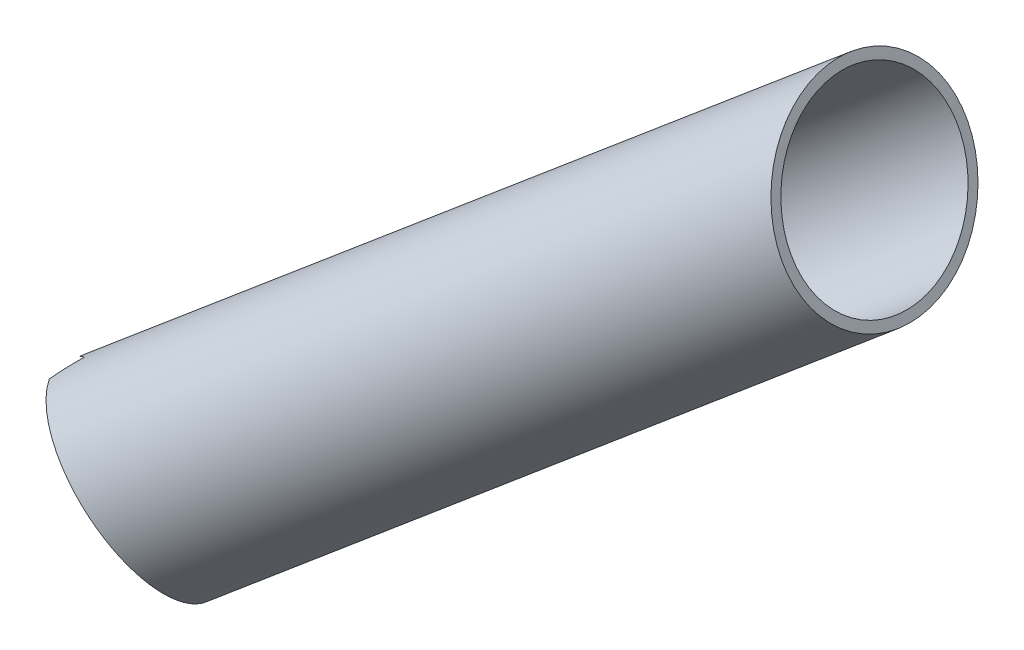
ISO-10303-21;
HEADER;
FILE_DESCRIPTION(('STEP AP214'),'2;1');
FILE_NAME('part.step','',(''),(''),'','','');
FILE_SCHEMA(('AUTOMOTIVE_DESIGN { 1 0 10303 214 1 1 1 1 }'));
ENDSEC;
DATA;
#1=APPLICATION_CONTEXT('core data for automotive mechanical design processes');
#2=APPLICATION_PROTOCOL_DEFINITION('international standard','automotive_design',2000,#1);
#3=PRODUCT_CONTEXT('',#1,'mechanical');
#4=PRODUCT('Part','Part','',(#3));
#5=PRODUCT_RELATED_PRODUCT_CATEGORY('part','',(#4));
#6=PRODUCT_DEFINITION_FORMATION('','',#4);
#7=PRODUCT_DEFINITION_CONTEXT('part definition',#1,'design');
#8=PRODUCT_DEFINITION('design','',#6,#7);
#9=PRODUCT_DEFINITION_SHAPE('','',#8);
#10=(LENGTH_UNIT() NAMED_UNIT(*) SI_UNIT(.MILLI.,.METRE.));
#11=(NAMED_UNIT(*) PLANE_ANGLE_UNIT() SI_UNIT($,.RADIAN.));
#12=(NAMED_UNIT(*) SI_UNIT($,.STERADIAN.) SOLID_ANGLE_UNIT());
#13=UNCERTAINTY_MEASURE_WITH_UNIT(LENGTH_MEASURE(1.E-05),#10,'distance_accuracy_value','');
#14=(GEOMETRIC_REPRESENTATION_CONTEXT(3) GLOBAL_UNCERTAINTY_ASSIGNED_CONTEXT((#13)) GLOBAL_UNIT_ASSIGNED_CONTEXT((#10,
#11,#12)) REPRESENTATION_CONTEXT('',''));
#15=CARTESIAN_POINT('',(0.,0.,0.));
#16=DIRECTION('',(0.,0.,1.));
#17=DIRECTION('',(1.,0.,0.));
#18=AXIS2_PLACEMENT_3D('',#15,#16,#17);
#19=CARTESIAN_POINT('',(-160.,500.,-1140.));
#20=DIRECTION('',(0.764911198117051,0.64413574578278,0.));
#21=DIRECTION('',(-0.64413574578278,0.764911198117051,0.));
#22=AXIS2_PLACEMENT_3D('',#19,#20,#21);
#23=CYLINDRICAL_SURFACE('',#22,11.3);
#24=CARTESIAN_POINT('',(-64.9999999999999,580.,-1140.));
#25=DIRECTION('',(0.939391078868926,0.342847489332319,0.));
#26=DIRECTION('',(-0.342847489332319,0.939391078868926,0.));
#27=AXIS2_PLACEMENT_3D('',#24,#25,#26);
#28=ELLIPSE('',#27,12.0290688874816,11.3);
#29=CARTESIAN_POINT('',(-69.1241360670785,591.3,-1140.));
#30=VERTEX_POINT('',#29);
#31=EDGE_CURVE('E91',#30,#30,#28,.T.);
#32=ORIENTED_EDGE('',*,*,#31,.T.);
#33=EDGE_LOOP('',(#32));
#34=FACE_BOUND('',#33,.T.);
#35=CARTESIAN_POINT('',(-146.708117260964,502.55732101697,-1149.16817016878));
#36=CARTESIAN_POINT('',(-146.739683424631,502.345930975982,-1149.0663024152));
#37=CARTESIAN_POINT('',(-146.773996918593,502.136267982787,-1148.96172759281));
#38=CARTESIAN_POINT('',(-146.847564243569,501.72059822978,-1148.74721144363));
#39=CARTESIAN_POINT('',(-146.886817814989,501.514591278497,-1148.63727039902));
#40=CARTESIAN_POINT('',(-146.969775897481,501.106110707302,-1148.41189166287));
#41=CARTESIAN_POINT('',(-147.013486925695,500.903642782999,-1148.29644605833));
#42=CARTESIAN_POINT('',(-147.104748678607,500.50277426245,-1148.06013408667));
#43=CARTESIAN_POINT('',(-147.152299444047,500.304373709388,-1147.93926766204));
#44=CARTESIAN_POINT('',(-147.251213693042,499.909648635833,-1147.69051672424));
#45=CARTESIAN_POINT('',(-147.302614792999,499.713374371743,-1147.56256739612));
#46=CARTESIAN_POINT('',(-147.40806651508,499.325620547626,-1147.30063889219));
#47=CARTESIAN_POINT('',(-147.462117090943,499.134140903969,-1147.16665982167));
#48=CARTESIAN_POINT('',(-147.572064899647,498.756578670189,-1146.8923044691));
#49=CARTESIAN_POINT('',(-147.627960781119,498.570492310068,-1146.75193284112));
#50=CARTESIAN_POINT('',(-147.740726878216,498.204238706476,-1146.4640737569));
#51=CARTESIAN_POINT('',(-147.797596948651,498.024070592444,-1146.31658735517));
#52=CARTESIAN_POINT('',(-147.902962140848,497.696185910938,-1146.03558716498));
#53=CARTESIAN_POINT('',(-147.951475218522,497.547553656253,-1145.90315079753));
#54=CARTESIAN_POINT('',(-148.047538748351,497.256052156458,-1145.63173021175));
#55=CARTESIAN_POINT('',(-148.09508921117,497.113182847489,-1145.49274606602));
#56=CARTESIAN_POINT('',(-148.188134668065,496.834348713796,-1145.20745380191));
#57=CARTESIAN_POINT('',(-148.233630803181,496.698380050895,-1145.0611498468));
#58=CARTESIAN_POINT('',(-148.321243489305,496.434815500366,-1144.76030003344));
#59=CARTESIAN_POINT('',(-148.36336040392,496.307218712182,-1144.60575506492));
#60=CARTESIAN_POINT('',(-148.469138422485,495.980288148145,-1144.18068698822));
#61=CARTESIAN_POINT('',(-148.528384761339,495.790006940792,-1143.90168527436));
#62=CARTESIAN_POINT('',(-148.599940982144,495.536352802048,-1143.46270673433));
#63=CARTESIAN_POINT('',(-148.620889785537,495.457187036728,-1143.31319720456));
#64=CARTESIAN_POINT('',(-148.656040686215,495.311157094088,-1143.00746690729));
#65=CARTESIAN_POINT('',(-148.670243533254,495.244291550214,-1142.85124688772));
#66=CARTESIAN_POINT('',(-148.691309809581,495.123816306365,-1142.53088901653));
#67=CARTESIAN_POINT('',(-148.698073539538,495.070393904693,-1142.36667370032));
#68=CARTESIAN_POINT('',(-148.703759801111,494.979222580263,-1142.03381562824));
#69=CARTESIAN_POINT('',(-148.702682670553,494.941472982312,-1141.86517306343));
#70=CARTESIAN_POINT('',(-148.693225486538,494.881950059903,-1141.52497389697));
#71=CARTESIAN_POINT('',(-148.684831033771,494.860208392173,-1141.35341220399));
#72=CARTESIAN_POINT('',(-148.661867579226,494.832269649608,-1141.00945126798));
#73=CARTESIAN_POINT('',(-148.647297138618,494.826076199397,-1140.83705183904));
#74=CARTESIAN_POINT('',(-148.610335073974,494.828231492872,-1140.46110770063));
#75=CARTESIAN_POINT('',(-148.5869969554,494.839470438549,-1140.2576781531));
#76=CARTESIAN_POINT('',(-148.53625128629,494.879604352112,-1139.85312538558));
#77=CARTESIAN_POINT('',(-148.5088425644,494.908504409622,-1139.65200284747));
#78=CARTESIAN_POINT('',(-148.452142158706,494.981603160561,-1139.25229439868));
#79=CARTESIAN_POINT('',(-148.42284547088,495.025843996534,-1139.05371705455));
#80=CARTESIAN_POINT('',(-148.364302802956,495.127491268384,-1138.65992773728));
#81=CARTESIAN_POINT('',(-148.335056846446,495.184902716836,-1138.46471707596));
#82=CARTESIAN_POINT('',(-148.259339794679,495.352879100305,-1137.94977687506));
#83=CARTESIAN_POINT('',(-148.214271350358,495.473483293926,-1137.63309613125));
#84=CARTESIAN_POINT('',(-148.13376048868,495.740248451501,-1137.0093719599));
#85=CARTESIAN_POINT('',(-148.098323443318,495.88642360348,-1136.70233399478));
#86=CARTESIAN_POINT('',(-148.040783201743,496.200350854788,-1136.09811530373));
#87=CARTESIAN_POINT('',(-148.018683123695,496.368107988843,-1135.80093689828));
#88=CARTESIAN_POINT('',(-147.990680297616,496.722228175635,-1135.21717153847));
#89=CARTESIAN_POINT('',(-147.98477447682,496.908587691725,-1134.93058258501));
#90=CARTESIAN_POINT('',(-147.99154645299,497.303781636305,-1134.36012026643));
#91=CARTESIAN_POINT('',(-148.004813019955,497.513137705086,-1134.07661410412));
#92=CARTESIAN_POINT('',(-148.053095224849,497.947118092536,-1133.52340826088));
#93=CARTESIAN_POINT('',(-148.088112380314,498.17174347557,-1133.2537095447));
#94=CARTESIAN_POINT('',(-148.181596627999,498.634040623479,-1132.73026625181));
#95=CARTESIAN_POINT('',(-148.240049025942,498.871704132786,-1132.47651179288));
#96=CARTESIAN_POINT('',(-148.381763518323,499.358039204268,-1131.98709570219));
#97=CARTESIAN_POINT('',(-148.465023439217,499.606709800418,-1131.7514324876));
#98=CARTESIAN_POINT('',(-148.653255345999,500.102102775913,-1131.31018735994));
#99=CARTESIAN_POINT('',(-148.757172174877,500.348470710964,-1131.10375904351));
#100=CARTESIAN_POINT('',(-148.989011401473,500.84683950227,-1130.71221030202));
#101=CARTESIAN_POINT('',(-149.11693369238,501.098840333455,-1130.52708978217));
#102=CARTESIAN_POINT('',(-149.396500728533,501.605671630787,-1130.18067008581));
#103=CARTESIAN_POINT('',(-149.548124012553,501.860499345126,-1130.01934961279));
#104=CARTESIAN_POINT('',(-149.874419544506,502.370418339132,-1129.72252404851));
#105=CARTESIAN_POINT('',(-150.049087732955,502.625509564544,-1129.58701442079));
#106=CARTESIAN_POINT('',(-150.392647329638,503.095548353975,-1129.36162183919));
#107=CARTESIAN_POINT('',(-150.55857796288,503.310857504991,-1129.26795557248));
#108=CARTESIAN_POINT('',(-150.904970781603,503.737816641542,-1129.10154037868));
#109=CARTESIAN_POINT('',(-151.085431255232,503.949467054578,-1129.02878899207));
#110=CARTESIAN_POINT('',(-151.459378087413,504.367377246328,-1128.9047796025));
#111=CARTESIAN_POINT('',(-151.652861105216,504.573638388877,-1128.85351611133));
#112=CARTESIAN_POINT('',(-152.051219388976,504.979292600071,-1128.77270025083));
#113=CARTESIAN_POINT('',(-152.256094658705,505.178685666441,-1128.7431478887));
#114=CARTESIAN_POINT('',(-152.664247206503,505.558868083491,-1128.70668553639));
#115=CARTESIAN_POINT('',(-152.867030255676,505.740082899566,-1128.69865519562));
#116=CARTESIAN_POINT('',(-153.279548958686,506.094211086256,-1128.7017112633));
#117=CARTESIAN_POINT('',(-153.48928425451,506.26712488322,-1128.71279668885));
#118=CARTESIAN_POINT('',(-153.914086847514,506.603921554969,-1128.75361262856));
#119=CARTESIAN_POINT('',(-154.129153904204,506.767804836004,-1128.78334230324));
#120=CARTESIAN_POINT('',(-154.563063039995,507.08604855399,-1128.86084030861));
#121=CARTESIAN_POINT('',(-154.781905536191,507.240407930045,-1128.9086106447));
#122=CARTESIAN_POINT('',(-155.237111253203,507.54966489906,-1129.02541941263));
#123=CARTESIAN_POINT('',(-155.473635167413,507.703854412382,-1129.09570515846));
#124=CARTESIAN_POINT('',(-155.947442102186,508.00082489133,-1129.25521177938));
#125=CARTESIAN_POINT('',(-156.1847251551,508.143605363835,-1129.3444334723));
#126=CARTESIAN_POINT('',(-156.658526778707,508.417959354928,-1129.54099177774));
#127=CARTESIAN_POINT('',(-156.89504460234,508.549523980808,-1129.6483425669));
#128=CARTESIAN_POINT('',(-157.365484217895,508.801647401352,-1129.88027909932));
#129=CARTESIAN_POINT('',(-157.599405779045,508.922205224436,-1130.00486636161));
#130=CARTESIAN_POINT('',(-158.096337309131,509.169430646673,-1130.28965570532));
#131=CARTESIAN_POINT('',(-158.358694134613,509.294484689116,-1130.45240293349));
#132=CARTESIAN_POINT('',(-158.875305349227,509.532086768936,-1130.79869158612));
#133=CARTESIAN_POINT('',(-159.129557723725,509.644631713783,-1130.9822381301));
#134=CARTESIAN_POINT('',(-159.6268754873,509.85882911945,-1131.36955215868));
#135=CARTESIAN_POINT('',(-159.869944066512,509.960484697547,-1131.573313824));
#136=CARTESIAN_POINT('',(-160.341254293209,510.15522112912,-1132.000985558));
#137=CARTESIAN_POINT('',(-160.569502611166,510.248305848263,-1132.22488645242));
#138=CARTESIAN_POINT('',(-160.919404249778,510.39325565597,-1132.60015186854));
#139=CARTESIAN_POINT('',(-161.047383995188,510.446806152384,-1132.74499944005));
#140=CARTESIAN_POINT('',(-161.294637081877,510.552937103798,-1133.04226874003));
#141=CARTESIAN_POINT('',(-161.413912415965,510.605517778758,-1133.19468872134));
#142=CARTESIAN_POINT('',(-161.641808764844,510.710784737776,-1133.50705327091));
#143=CARTESIAN_POINT('',(-161.75044005907,510.763470868784,-1133.66699035417));
#144=CARTESIAN_POINT('',(-161.954829003737,510.870314884679,-1133.99444737815));
#145=CARTESIAN_POINT('',(-162.050589990227,510.924472383789,-1134.16196533876));
#146=CARTESIAN_POINT('',(-162.206065915649,511.02283519082,-1134.46453039996));
#147=CARTESIAN_POINT('',(-162.26899372422,511.066442476463,-1134.59811823468));
#148=CARTESIAN_POINT('',(-162.384157501382,511.15603010461,-1134.86903727342));
#149=CARTESIAN_POINT('',(-162.436397064785,511.202009642709,-1135.00636720118));
#150=CARTESIAN_POINT('',(-162.528703980882,511.296789962671,-1135.28372032477));
#151=CARTESIAN_POINT('',(-162.568801460304,511.345583398237,-1135.42373592268));
#152=CARTESIAN_POINT('',(-162.635852031495,511.446448448103,-1135.70573699141));
#153=CARTESIAN_POINT('',(-162.662805809982,511.498519890976,-1135.84772235891));
#154=CARTESIAN_POINT('',(-162.70300829159,511.606309085585,-1136.13316742827));
#155=CARTESIAN_POINT('',(-162.71618072891,511.662045332777,-1136.27663094345));
#156=CARTESIAN_POINT('',(-162.728534030766,511.776657598011,-1136.56289381916));
#157=CARTESIAN_POINT('',(-162.727714760142,511.835533646377,-1136.70569317326));
#158=CARTESIAN_POINT('',(-162.712719623785,511.956014223297,-1136.98966665947));
#159=CARTESIAN_POINT('',(-162.698522786839,512.017622891086,-1137.13083788748));
#160=CARTESIAN_POINT('',(-162.657893106905,512.142849515981,-1137.41052412641));
#161=CARTESIAN_POINT('',(-162.631455368653,512.206468267448,-1137.54903805154));
#162=CARTESIAN_POINT('',(-162.553103665957,512.364571489904,-1137.88584384117));
#163=CARTESIAN_POINT('',(-162.495065453239,512.459806443532,-1138.08235820425));
#164=CARTESIAN_POINT('',(-162.360332682031,512.651209833722,-1138.4683860965));
#165=CARTESIAN_POINT('',(-162.283626693406,512.747378807409,-1138.65789525423));
#166=CARTESIAN_POINT('',(-162.114646106439,512.939970520031,-1139.03201811463));
#167=CARTESIAN_POINT('',(-162.022243496705,513.036388348863,-1139.21657581783));
#168=CARTESIAN_POINT('',(-161.82536684552,513.227510198026,-1139.57993788892));
#169=CARTESIAN_POINT('',(-161.720894583048,513.322214468551,-1139.75874309974));
#170=CARTESIAN_POINT('',(-161.478809646195,513.529006869572,-1140.14915304032));
#171=CARTESIAN_POINT('',(-161.338878498606,513.640499846818,-1140.35962944106));
#172=CARTESIAN_POINT('',(-161.047390771127,513.858663907046,-1140.77500904324));
#173=CARTESIAN_POINT('',(-160.895830612704,513.965333489572,-1140.97991050264));
#174=CARTESIAN_POINT('',(-160.58286419167,514.17308412078,-1141.38551271267));
#175=CARTESIAN_POINT('',(-160.421443717581,514.274156682862,-1141.58620681216));
#176=CARTESIAN_POINT('',(-160.090362666852,514.469773599274,-1141.98394938466));
#177=CARTESIAN_POINT('',(-159.920701754027,514.564317686881,-1142.18099770848));
#178=CARTESIAN_POINT('',(-159.581673436957,514.742213300338,-1142.56359247659));
#179=CARTESIAN_POINT('',(-159.4126119089,514.825872306368,-1142.74926731906));
#180=CARTESIAN_POINT('',(-159.068551544733,514.985927794597,-1143.11822838479));
#181=CARTESIAN_POINT('',(-158.893552759471,515.062324338975,-1143.30151462851));
#182=CARTESIAN_POINT('',(-158.53873128131,515.206973125274,-1143.6653512903));
#183=CARTESIAN_POINT('',(-158.358926536661,515.275251569273,-1143.84590877207));
#184=CARTESIAN_POINT('',(-157.994335319439,515.40326817138,-1144.20502754374));
#185=CARTESIAN_POINT('',(-157.809548584212,515.463005878161,-1144.38358872768));
#186=CARTESIAN_POINT('',(-157.622478576112,515.518125078709,-1144.56120243974));
#187=B_SPLINE_CURVE_WITH_KNOTS('',3,(#35,#36,#37,#38,#39,#40,#41,#42,#43,#44,#45,#46,#47,#48,
#49,#50,#51,#52,#53,#54,#55,#56,#57,#58,#59,#60,#61,#62,#63,#64,#65,#66,#67,#68,#69,#70,#71,#72,
#73,#74,#75,#76,#77,#78,#79,#80,#81,#82,#83,#84,#85,#86,#87,#88,#89,#90,#91,#92,#93,#94,#95,#96,
#97,#98,#99,#100,#101,#102,#103,#104,#105,#106,#107,#108,#109,#110,#111,#112,#113,#114,#115,
#116,#117,#118,#119,#120,#121,#122,#123,#124,#125,#126,#127,#128,#129,#130,#131,#132,#133,#134,
#135,#136,#137,#138,#139,#140,#141,#142,#143,#144,#145,#146,#147,#148,#149,#150,#151,#152,#153,
#154,#155,#156,#157,#158,#159,#160,#161,#162,#163,#164,#165,#166,#167,#168,#169,#170,#171,#172,
#173,#174,#175,#176,#177,#178,#179,#180,#181,#182,#183,#184,#185,#186),.UNSPECIFIED.,.F.,.F.,(4,
2,2,2,2,2,2,2,2,2,2,2,2,2,2,2,2,2,2,2,2,2,2,2,2,2,2,2,2,2,2,2,2,2,2,2,2,2,2,2,2,2,2,2,2,2,2,2,2,
2,2,2,2,2,2,2,2,2,2,2,2,2,2,2,2,2,2,2,2,2,2,2,2,2,2,4),(0.,0.710251146551974,1.42046498583626,
2.13173251942728,2.84300760098638,3.56247771548598,4.28193527201763,5.00087715331004,
5.71971280195808,6.33425370163821,6.94878778971427,7.56297623814223,8.17709851017333,
9.2016790666583,9.7125043579648,10.2232728622919,10.7408063059891,11.2583174517289,
11.7768492807609,12.29550197948,12.9097333042611,13.5241417233166,14.1402515289687,
14.7565962087178,15.7806405126585,16.8052548193896,17.8301085868808,18.854767881055,
19.9115702036147,20.9684462674567,22.0246606867104,23.0807825915926,24.0926806171487,
25.1045741403779,26.1155566468114,27.1263613004347,27.9877914137446,28.8491201846511,
29.7102288299542,30.5713377603907,31.3866614561797,32.2019432312201,33.0171882996643,
33.8325240173331,34.7045213317689,35.5765563152573,36.4492764003274,37.3220734467384,
38.3203541006894,39.3188810056158,40.3171212960377,41.3149091273274,41.9163373934585,
42.5176275323237,43.1183311328928,43.7188787265107,44.1804181271283,44.6418020405635,
45.1020316149601,45.5622371411913,46.0249761818727,46.4877196926354,46.9511898277594,
47.4148454697046,48.0915481306057,48.7686661784101,49.4515976780716,50.1344286467554,
50.9627405919726,51.7913084595071,52.6211000701537,53.4509255623222,54.2447914084747,
55.0386504573646,55.8298733675123,56.6211380735351),.UNSPECIFIED.);
#188=CARTESIAN_POINT('',(-148.696345115635,494.902609087071,-1141.64148695709));
#189=VERTEX_POINT('',#188);
#190=CARTESIAN_POINT('',(-161.894042172333,513.160640654045,-1139.45276851652));
#191=VERTEX_POINT('',#190);
#192=EDGE_CURVE('E83',#189,#191,#187,.T.);
#193=ORIENTED_EDGE('',*,*,#192,.T.);
#194=CARTESIAN_POINT('',(-158.834675657744,514.898941958347,-1136.21077717234));
#195=CARTESIAN_POINT('',(-159.000636737981,514.824267788879,-1136.35069454457));
#196=CARTESIAN_POINT('',(-159.164632350642,514.747914627888,-1136.49206988941));
#197=CARTESIAN_POINT('',(-159.488193996948,514.592174969885,-1136.77829501195));
#198=CARTESIAN_POINT('',(-159.647758555011,514.51278748284,-1136.92314591781));
#199=CARTESIAN_POINT('',(-159.963928586419,514.350284830594,-1137.21873297997));
#200=CARTESIAN_POINT('',(-160.120466918327,514.26713422921,-1137.36952166264));
#201=CARTESIAN_POINT('',(-160.427533154448,514.098535991974,-1137.67583916382));
#202=CARTESIAN_POINT('',(-160.578061672487,514.01308859221,-1137.83136749536));
#203=CARTESIAN_POINT('',(-160.881925616413,513.834573250804,-1138.15871636436));
#204=CARTESIAN_POINT('',(-161.034767635382,513.74137957941,-1138.33092879476));
#205=CARTESIAN_POINT('',(-161.330559633132,513.553666836496,-1138.68313087384));
#206=CARTESIAN_POINT('',(-161.473506403626,513.459147346948,-1138.86312301445));
#207=CARTESIAN_POINT('',(-161.746061422955,513.270340092721,-1139.23133627647));
#208=CARTESIAN_POINT('',(-161.875738936089,513.176053928366,-1139.41950649702));
#209=CARTESIAN_POINT('',(-162.118943545225,512.988580935976,-1139.80642822539));
#210=CARTESIAN_POINT('',(-162.232485622418,512.895393162842,-1140.00516967937));
#211=CARTESIAN_POINT('',(-162.409527609233,512.737769557692,-1140.35655228505));
#212=CARTESIAN_POINT('',(-162.478096806152,512.672658849371,-1140.50632667135));
#213=CARTESIAN_POINT('',(-162.602454150085,512.544578096015,-1140.81208265539));
#214=CARTESIAN_POINT('',(-162.658239719492,512.481608484874,-1140.96806549754));
#215=CARTESIAN_POINT('',(-162.754180351291,512.359498372195,-1141.28338285105));
#216=CARTESIAN_POINT('',(-162.794555785587,512.300314816062,-1141.44263287163));
#217=CARTESIAN_POINT('',(-162.85913553301,512.18537746318,-1141.76560201276));
#218=CARTESIAN_POINT('',(-162.883341794927,512.129623253844,-1141.92932059225));
#219=CARTESIAN_POINT('',(-162.914777452151,512.021276237949,-1142.26134276802));
#220=CARTESIAN_POINT('',(-162.921825787693,511.968722806205,-1142.42967646577));
#221=CARTESIAN_POINT('',(-162.918427486912,511.867303220566,-1142.76726173641));
#222=CARTESIAN_POINT('',(-162.907979691089,511.818437311274,-1142.93651336939));
#223=CARTESIAN_POINT('',(-162.870447951279,511.723564881415,-1143.27501261584));
#224=CARTESIAN_POINT('',(-162.843266695094,511.677576832971,-1143.44425437165));
#225=CARTESIAN_POINT('',(-162.773800321002,511.587886495323,-1143.78024895164));
#226=CARTESIAN_POINT('',(-162.731508317342,511.544185258613,-1143.94700060496));
#227=CARTESIAN_POINT('',(-162.617734860556,511.444024005857,-1144.3306920611));
#228=CARTESIAN_POINT('',(-162.541232112193,511.388050580639,-1144.54626569757));
#229=CARTESIAN_POINT('',(-162.369143500613,511.276058462253,-1144.96960784979));
#230=CARTESIAN_POINT('',(-162.273550028735,511.220039759932,-1145.17737321419));
#231=CARTESIAN_POINT('',(-162.066679250649,511.105899014846,-1145.58467071954));
#232=CARTESIAN_POINT('',(-161.955380431744,511.047774169701,-1145.78419107383));
#233=CARTESIAN_POINT('',(-161.720018031882,510.927897996441,-1146.17435252609));
#234=CARTESIAN_POINT('',(-161.595954649851,510.866146724847,-1146.36499376237));
#235=CARTESIAN_POINT('',(-161.280774953505,510.70968300486,-1146.81852829302));
#236=CARTESIAN_POINT('',(-161.084031749288,510.612350459637,-1147.07662799883));
#237=CARTESIAN_POINT('',(-160.673718545006,510.404759144968,-1147.57359964371));
#238=CARTESIAN_POINT('',(-160.460142908946,510.294496039908,-1147.812465088));
#239=CARTESIAN_POINT('',(-160.020008202916,510.059216083333,-1148.27004272507));
#240=CARTESIAN_POINT('',(-159.793451498635,509.934201915703,-1148.48875857111));
#241=CARTESIAN_POINT('',(-159.330461644826,509.668178276828,-1148.90497564655));
#242=CARTESIAN_POINT('',(-159.094028849552,509.527169379001,-1149.10247763597));
#243=CARTESIAN_POINT('',(-158.61288459385,509.227703671834,-1149.47587504755));
#244=CARTESIAN_POINT('',(-158.368138263207,509.069164803179,-1149.65165992852));
#245=CARTESIAN_POINT('',(-157.874144560134,508.734938032462,-1149.97900629491));
#246=CARTESIAN_POINT('',(-157.624897024341,508.559249506956,-1150.13056689917));
#247=CARTESIAN_POINT('',(-157.124692042871,508.191011324691,-1150.40783513251));
#248=CARTESIAN_POINT('',(-156.873735560799,507.998470544279,-1150.53355625619));
#249=CARTESIAN_POINT('',(-156.372670933836,507.597092201988,-1150.7577310864));
#250=CARTESIAN_POINT('',(-156.122562715182,507.388256097081,-1150.85618722713));
#251=CARTESIAN_POINT('',(-155.642334013235,506.969704869163,-1151.01892069643));
#252=CARTESIAN_POINT('',(-155.411985846591,506.760961888661,-1151.08502824979));
#253=CARTESIAN_POINT('',(-154.956581832545,506.331449628179,-1151.19140463885));
#254=CARTESIAN_POINT('',(-154.731525786037,506.110680801692,-1151.23167444816));
#255=CARTESIAN_POINT('',(-154.288954893115,505.658767614213,-1151.28574128587));
#256=CARTESIAN_POINT('',(-154.071436936814,505.427627624443,-1151.29954936202));
#257=CARTESIAN_POINT('',(-153.645894598495,504.956726199359,-1151.30042882098));
#258=CARTESIAN_POINT('',(-153.437869614823,504.716965312153,-1151.28750190062));
#259=CARTESIAN_POINT('',(-153.050211293854,504.251344005913,-1151.23719636603));
#260=CARTESIAN_POINT('',(-152.869661643405,504.026010753601,-1151.20196598483));
#261=CARTESIAN_POINT('',(-152.519344982687,503.571540198511,-1151.10946423725));
#262=CARTESIAN_POINT('',(-152.349577242426,503.342403154597,-1151.05219436492));
#263=CARTESIAN_POINT('',(-152.021884471657,502.882091372707,-1150.91617818768));
#264=CARTESIAN_POINT('',(-151.863958329887,502.650916828217,-1150.83743390125));
#265=CARTESIAN_POINT('',(-151.560746737699,502.188266322148,-1150.65923236475));
#266=CARTESIAN_POINT('',(-151.415461559397,501.956790354189,-1150.55977466894));
#267=CARTESIAN_POINT('',(-151.138442031987,501.495827415377,-1150.34134028661));
#268=CARTESIAN_POINT('',(-151.006676429042,501.266337033941,-1150.2224103479));
#269=CARTESIAN_POINT('',(-150.756634496749,500.81046694246,-1149.96590995778));
#270=CARTESIAN_POINT('',(-150.638358054826,500.584087206469,-1149.82833966194));
#271=CARTESIAN_POINT('',(-150.415363933483,500.136009095201,-1149.53564084371));
#272=CARTESIAN_POINT('',(-150.310648346657,499.914311446831,-1149.38050961838));
#273=CARTESIAN_POINT('',(-150.114648896903,499.477177618043,-1149.05382529634));
#274=CARTESIAN_POINT('',(-150.023365491907,499.261741651301,-1148.88227164008));
#275=CARTESIAN_POINT('',(-149.847457695727,498.82266287397,-1148.510296152));
#276=CARTESIAN_POINT('',(-149.763855927454,498.59962792534,-1148.30867274));
#277=CARTESIAN_POINT('',(-149.610985852226,498.164405440827,-1147.88893758497));
#278=CARTESIAN_POINT('',(-149.541719011713,497.952219016401,-1147.67082415815));
#279=CARTESIAN_POINT('',(-149.416361894646,497.540512027339,-1147.21905711862));
#280=CARTESIAN_POINT('',(-149.360282476312,497.3410019981,-1146.98539090178));
#281=CARTESIAN_POINT('',(-149.259857091872,496.957058622527,-1146.50364026797));
#282=CARTESIAN_POINT('',(-149.215509301722,496.772622935506,-1146.25555809974));
#283=CARTESIAN_POINT('',(-149.142411187894,496.447883954601,-1145.78406557726));
#284=CARTESIAN_POINT('',(-149.112318117392,496.305115324626,-1145.56255716967));
#285=CARTESIAN_POINT('',(-149.057395050752,496.034374801936,-1145.10996305023));
#286=CARTESIAN_POINT('',(-149.032565799633,495.906405004951,-1144.8788759882));
#287=CARTESIAN_POINT('',(-148.9859888545,495.668082324328,-1144.40784969318));
#288=CARTESIAN_POINT('',(-148.964237016872,495.557705726277,-1144.16792292223));
#289=CARTESIAN_POINT('',(-148.920863671125,495.357825224795,-1143.67952563862));
#290=CARTESIAN_POINT('',(-148.899242094688,495.268309243339,-1143.43106016585));
#291=CARTESIAN_POINT('',(-148.861156238688,495.143449228796,-1143.02160205421));
#292=CARTESIAN_POINT('',(-148.845809687205,495.100392072574,-1142.86284757698));
#293=CARTESIAN_POINT('',(-148.812603114374,495.025354372154,-1142.54302028523));
#294=CARTESIAN_POINT('',(-148.794744002674,494.993369833665,-1142.38194832859));
#295=CARTESIAN_POINT('',(-148.755428085311,494.941797280283,-1142.05868427744));
#296=CARTESIAN_POINT('',(-148.733981109081,494.922176076037,-1141.8964963737));
#297=CARTESIAN_POINT('',(-148.686372776804,494.896328375053,-1141.57171701172));
#298=CARTESIAN_POINT('',(-148.660211636564,494.890101265323,-1141.40912557229));
#299=CARTESIAN_POINT('',(-148.601996920093,494.891826086714,-1141.08329489237));
#300=CARTESIAN_POINT('',(-148.569884653889,494.899926790876,-1140.92006662276));
#301=CARTESIAN_POINT('',(-148.499449781561,494.930780146399,-1140.59636162945));
#302=CARTESIAN_POINT('',(-148.461127538598,494.953531941189,-1140.43588474545));
#303=CARTESIAN_POINT('',(-148.378238371146,495.013156928003,-1140.11911158399));
#304=CARTESIAN_POINT('',(-148.333666942858,495.050040338228,-1139.96281841937));
#305=CARTESIAN_POINT('',(-148.238763905677,495.136735605392,-1139.65567494937));
#306=CARTESIAN_POINT('',(-148.188431263928,495.186549782566,-1139.50482562636));
#307=CARTESIAN_POINT('',(-148.068514492874,495.312531183479,-1139.16929725896));
#308=CARTESIAN_POINT('',(-147.99740105243,495.392182321392,-1138.98647714491));
#309=CARTESIAN_POINT('',(-147.848987672208,495.566457395051,-1138.63078704134));
#310=CARTESIAN_POINT('',(-147.771684901055,495.661088202965,-1138.45792166861));
#311=CARTESIAN_POINT('',(-147.612065270072,495.863112159362,-1138.12017825458));
#312=CARTESIAN_POINT('',(-147.529713637773,495.970600181752,-1137.95537406113));
#313=CARTESIAN_POINT('',(-147.362046769885,496.195363628691,-1137.63412349553));
#314=CARTESIAN_POINT('',(-147.276730310935,496.312643122121,-1137.47768064269));
#315=CARTESIAN_POINT('',(-147.051099447032,496.630088785338,-1137.0775726907));
#316=CARTESIAN_POINT('',(-146.90939777227,496.836666081157,-1136.83978940571));
#317=CARTESIAN_POINT('',(-146.625229573298,497.265442076553,-1136.37903455823));
#318=CARTESIAN_POINT('',(-146.482762490994,497.487654208317,-1136.15607605984));
#319=CARTESIAN_POINT('',(-146.204013156929,497.937585620033,-1135.72865062531));
#320=CARTESIAN_POINT('',(-146.067674397794,498.164933284893,-1135.52382789756));
#321=CARTESIAN_POINT('',(-145.865954558833,498.513155178263,-1135.22373536941));
#322=CARTESIAN_POINT('',(-145.799247321821,498.630303532871,-1135.1249938692));
#323=CARTESIAN_POINT('',(-145.666886060319,498.86693011415,-1134.9296343474));
#324=CARTESIAN_POINT('',(-145.601231977362,498.986408210661,-1134.83301620784));
#325=CARTESIAN_POINT('',(-145.536187735397,499.106987550559,-1134.73736515822));
#326=B_SPLINE_CURVE_WITH_KNOTS('',3,(#194,#195,#196,#197,#198,#199,#200,#201,#202,#203,#204,
#205,#206,#207,#208,#209,#210,#211,#212,#213,#214,#215,#216,#217,#218,#219,#220,#221,#222,#223,
#224,#225,#226,#227,#228,#229,#230,#231,#232,#233,#234,#235,#236,#237,#238,#239,#240,#241,#242,
#243,#244,#245,#246,#247,#248,#249,#250,#251,#252,#253,#254,#255,#256,#257,#258,#259,#260,#261,
#262,#263,#264,#265,#266,#267,#268,#269,#270,#271,#272,#273,#274,#275,#276,#277,#278,#279,#280,
#281,#282,#283,#284,#285,#286,#287,#288,#289,#290,#291,#292,#293,#294,#295,#296,#297,#298,#299,
#300,#301,#302,#303,#304,#305,#306,#307,#308,#309,#310,#311,#312,#313,#314,#315,#316,#317,#318,
#319,#320,#321,#322,#323,#324,#325),.UNSPECIFIED.,.F.,.F.,(4,2,2,2,2,2,2,2,2,2,2,2,2,2,2,2,2,2,
2,2,2,2,2,2,2,2,2,2,2,2,2,2,2,2,2,2,2,2,2,2,2,2,2,2,2,2,2,2,2,2,2,2,2,2,2,2,2,2,2,2,2,2,2,2,2,
4),(0.,0.688670826410225,1.37756830125659,2.07558599915786,2.77353222016183,3.51847118996992,
4.26365056728926,5.00471710552157,5.74509102994859,6.27598211525615,6.80698015190186,
7.3300715520865,7.85309989527943,8.38162404208674,8.91018321647048,9.44184560955265,
9.97375058324651,10.6791093086041,11.3847497197312,12.0913662509305,12.797971771637,
13.8130729267233,14.828515423489,15.8437734494088,16.8589950894559,17.8791881670342,
18.8994183456642,19.9191143501801,20.9387192874259,21.8908714307195,22.8429876933898,
23.7947063614942,24.7463646268365,25.617973565688,26.4895234290593,27.3609914002764,
28.2324781266202,29.1019025173187,29.971319651739,30.8408707877277,31.7104515617763,
32.6456656530636,33.5809753680951,34.517052519943,35.452984044078,36.2481340595689,
37.0433965422604,37.8375778316163,38.6312981515287,39.1265725025099,39.6216680036473,
40.1154286947885,40.6091667880837,41.1080617547585,41.6069275563715,42.1061547575919,
42.6054715997934,43.2395624582058,43.8739450637789,44.5133368891938,45.152995751322,
46.1881799269007,47.2242645719376,48.2289155827571,48.7301985629485,49.231453616728),.UNSPECIFIED.);
#327=EDGE_CURVE('E81',#191,#189,#326,.T.);
#328=ORIENTED_EDGE('',*,*,#327,.T.);
#329=EDGE_LOOP('',(#193,#328));
#330=FACE_BOUND('',#329,.T.);
#331=ADVANCED_FACE('F41',(#34,#330),#23,.F.);
#332=CARTESIAN_POINT('',(-65.,580.,-1140.));
#333=DIRECTION('',(0.939391078868926,0.342847489332319,0.));
#334=DIRECTION('',(-0.342847489332319,0.939391078868926,0.));
#335=AXIS2_PLACEMENT_3D('',#332,#333,#334);
#336=PLANE('',#335);
#337=ORIENTED_EDGE('',*,*,#31,.F.);
#338=EDGE_LOOP('',(#337));
#339=FACE_BOUND('',#338,.T.);
#340=CARTESIAN_POINT('',(-64.9999999999999,580.,-1140.));
#341=DIRECTION('',(0.939391078868926,0.342847489332319,0.));
#342=DIRECTION('',(-0.342847489332319,0.939391078868926,0.));
#343=AXIS2_PLACEMENT_3D('',#340,#341,#342);
#344=ELLIPSE('',#343,13.30649213217,12.5);
#345=CARTESIAN_POINT('',(-69.5620974193347,592.5,-1140.));
#346=VERTEX_POINT('',#345);
#347=EDGE_CURVE('E90',#346,#346,#344,.T.);
#348=ORIENTED_EDGE('',*,*,#347,.T.);
#349=EDGE_LOOP('',(#348));
#350=FACE_BOUND('',#349,.T.);
#351=ADVANCED_FACE('F43',(#339,#350),#336,.T.);
#352=CARTESIAN_POINT('',(-160.,500.,-1140.));
#353=DIRECTION('',(0.764911198117051,0.64413574578278,0.));
#354=DIRECTION('',(-0.64413574578278,0.764911198117051,0.));
#355=AXIS2_PLACEMENT_3D('',#352,#353,#354);
#356=CYLINDRICAL_SURFACE('',#355,12.5);
#357=ORIENTED_EDGE('',*,*,#347,.F.);
#358=EDGE_LOOP('',(#357));
#359=FACE_BOUND('',#358,.T.);
#360=CARTESIAN_POINT('',(-160.,500.,-1140.));
#361=DIRECTION('',(0.582837597226065,0.211973530034795,0.784453668373305));
#362=DIRECTION('',(0.523402542330844,0.640510105074051,-0.561957813345127));
#363=AXIS2_PLACEMENT_3D('',#360,#361,#362);
#364=ELLIPSE('',#363,21.4644330015771,12.5);
#365=CARTESIAN_POINT('',(-167.769633537261,509.226439825498,-1136.72042642358));
#366=VERTEX_POINT('',#365);
#367=CARTESIAN_POINT('',(-165.576215974889,511.592516081656,-1138.98946005792));
#368=VERTEX_POINT('',#367);
#369=EDGE_CURVE('E11',#366,#368,#364,.F.);
#370=ORIENTED_EDGE('',*,*,#369,.F.);
#371=CARTESIAN_POINT('',(-160.,500.,-1140.));
#372=DIRECTION('',(0.523402542330844,0.640510105074051,-0.561957813345127));
#373=DIRECTION('',(0.582837597226065,0.211973530034795,0.784453668373305));
#374=AXIS2_PLACEMENT_3D('',#371,#372,#373);
#375=ELLIPSE('',#374,15.3764413636716,12.5);
#376=CARTESIAN_POINT('',(-150.961601297556,491.374284448398,-1141.41316144376));
#377=VERTEX_POINT('',#376);
#378=EDGE_CURVE('E74',#377,#366,#375,.F.);
#379=ORIENTED_EDGE('',*,*,#378,.F.);
#380=CARTESIAN_POINT('',(-160.,500.,-1140.));
#381=DIRECTION('',(0.634918177270863,0.582066326047571,0.508013484321556));
#382=DIRECTION('',(0.429034500900139,0.281202027801956,-0.858402479375168));
#383=AXIS2_PLACEMENT_3D('',#380,#381,#382);
#384=ELLIPSE('',#383,14.5249906702985,12.5);
#385=CARTESIAN_POINT('',(-168.031269992275,509.537133115826,-1140.88982820937));
#386=VERTEX_POINT('',#385);
#387=EDGE_CURVE('E86',#386,#377,#384,.F.);
#388=ORIENTED_EDGE('',*,*,#387,.F.);
#389=CARTESIAN_POINT('',(-160.,500.,-1140.));
#390=DIRECTION('',(0.429034500900139,0.281202027801956,-0.858402479375168));
#391=DIRECTION('',(0.634918177270863,0.582066326047571,0.508013484321556));
#392=AXIS2_PLACEMENT_3D('',#389,#390,#391);
#393=ELLIPSE('',#392,24.5432225503553,12.5);
#394=EDGE_CURVE('E49',#368,#386,#393,.F.);
#395=ORIENTED_EDGE('',*,*,#394,.F.);
#396=EDGE_LOOP('',(#370,#379,#388,#395));
#397=FACE_BOUND('',#396,.T.);
#398=ADVANCED_FACE('F85',(#359,#397),#356,.T.);
#399=CARTESIAN_POINT('',(-160.,500.,-1140.));
#400=DIRECTION('',(-0.0860700691861797,-0.397246473166983,0.913666888284061));
#401=DIRECTION('',(0.,-0.917070056253235,-0.39872611141445));
#402=AXIS2_PLACEMENT_3D('',#399,#400,#401);
#403=CYLINDRICAL_SURFACE('',#402,12.5);
#404=CARTESIAN_POINT('',(-160.,500.,-1140.));
#405=DIRECTION('',(0.133991346812806,-0.0219122293107185,0.990740214781819));
#406=DIRECTION('',(0.480296136468892,0.8759210569698,-0.0455842434396292));
#407=AXIS2_PLACEMENT_3D('',#404,#405,#406);
#408=ELLIPSE('',#407,13.8522813040928,12.5);
#409=EDGE_CURVE('E61',#377,#189,#408,.T.);
#410=ORIENTED_EDGE('',*,*,#409,.F.);
#411=ORIENTED_EDGE('',*,*,#378,.T.);
#412=ORIENTED_EDGE('',*,*,#369,.T.);
#413=EDGE_CURVE('E55',#191,#368,#408,.T.);
#414=ORIENTED_EDGE('',*,*,#413,.F.);
#415=ORIENTED_EDGE('',*,*,#192,.F.);
#416=EDGE_LOOP('',(#410,#411,#412,#414,#415));
#417=FACE_BOUND('',#416,.T.);
#418=ADVANCED_FACE('F72',(#417),#403,.F.);
#419=CARTESIAN_POINT('',(-325.,320.,-1580.));
#420=DIRECTION('',(0.327891874330321,0.357700226542168,0.874378331547523));
#421=DIRECTION('',(0.,-0.925546956205677,0.378632845720504));
#422=AXIS2_PLACEMENT_3D('',#419,#420,#421);
#423=CYLINDRICAL_SURFACE('',#422,12.5);
#424=ORIENTED_EDGE('',*,*,#413,.T.);
#425=ORIENTED_EDGE('',*,*,#394,.T.);
#426=ORIENTED_EDGE('',*,*,#387,.T.);
#427=ORIENTED_EDGE('',*,*,#409,.T.);
#428=ORIENTED_EDGE('',*,*,#327,.F.);
#429=EDGE_LOOP('',(#424,#425,#426,#427,#428));
#430=FACE_BOUND('',#429,.T.);
#431=ADVANCED_FACE('F78',(#430),#423,.F.);
#432=CLOSED_SHELL('',(#331,#351,#398,#418,#431));
#433=MANIFOLD_SOLID_BREP('B2',#432);
#434=ADVANCED_BREP_SHAPE_REPRESENTATION('',(#18,#433),#14);
#435=SHAPE_DEFINITION_REPRESENTATION(#9,#434);
ENDSEC;
END-ISO-10303-21;
